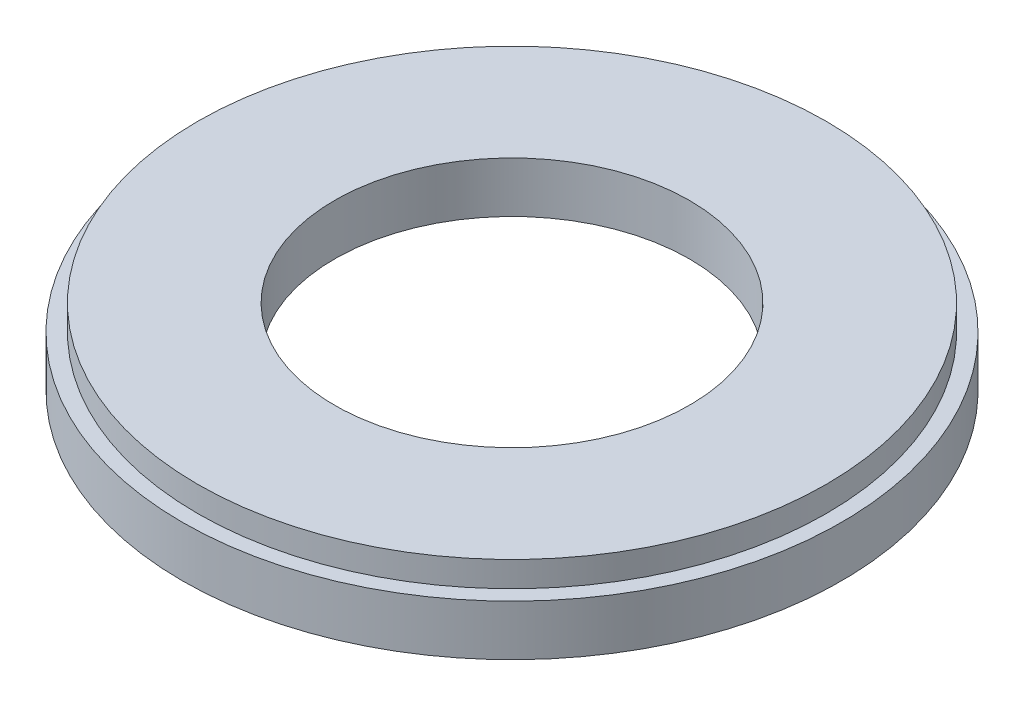
ISO-10303-21;
HEADER;
FILE_DESCRIPTION(('STEP AP214'),'2;1');
FILE_NAME('part.step','',(''),(''),'','','');
FILE_SCHEMA(('AUTOMOTIVE_DESIGN { 1 0 10303 214 1 1 1 1 }'));
ENDSEC;
DATA;
#1=APPLICATION_CONTEXT('core data for automotive mechanical design processes');
#2=APPLICATION_PROTOCOL_DEFINITION('international standard','automotive_design',2000,#1);
#3=PRODUCT_CONTEXT('',#1,'mechanical');
#4=PRODUCT('Part','Part','',(#3));
#5=PRODUCT_RELATED_PRODUCT_CATEGORY('part','',(#4));
#6=PRODUCT_DEFINITION_FORMATION('','',#4);
#7=PRODUCT_DEFINITION_CONTEXT('part definition',#1,'design');
#8=PRODUCT_DEFINITION('design','',#6,#7);
#9=PRODUCT_DEFINITION_SHAPE('','',#8);
#10=(LENGTH_UNIT() NAMED_UNIT(*) SI_UNIT(.MILLI.,.METRE.));
#11=(NAMED_UNIT(*) PLANE_ANGLE_UNIT() SI_UNIT($,.RADIAN.));
#12=(NAMED_UNIT(*) SI_UNIT($,.STERADIAN.) SOLID_ANGLE_UNIT());
#13=UNCERTAINTY_MEASURE_WITH_UNIT(LENGTH_MEASURE(1.E-05),#10,'distance_accuracy_value','');
#14=(GEOMETRIC_REPRESENTATION_CONTEXT(3) GLOBAL_UNCERTAINTY_ASSIGNED_CONTEXT((#13)) GLOBAL_UNIT_ASSIGNED_CONTEXT((#10,
#11,#12)) REPRESENTATION_CONTEXT('',''));
#15=CARTESIAN_POINT('',(0.,0.,0.));
#16=DIRECTION('',(0.,0.,1.));
#17=DIRECTION('',(1.,0.,0.));
#18=AXIS2_PLACEMENT_3D('',#15,#16,#17);
#19=CARTESIAN_POINT('',(0.,0.,0.));
#20=DIRECTION('',(0.,-1.,0.));
#21=DIRECTION('',(0.,0.,-1.));
#22=AXIS2_PLACEMENT_3D('',#19,#20,#21);
#23=PLANE('',#22);
#24=CARTESIAN_POINT('',(0.,0.,0.));
#25=DIRECTION('',(0.,-1.,0.));
#26=DIRECTION('',(0.,0.,-1.));
#27=AXIS2_PLACEMENT_3D('',#24,#25,#26);
#28=CIRCLE('',#27,35.);
#29=CARTESIAN_POINT('',(0.,0.,-35.));
#30=VERTEX_POINT('',#29);
#31=EDGE_CURVE('E74',#30,#30,#28,.T.);
#32=ORIENTED_EDGE('',*,*,#31,.F.);
#33=EDGE_LOOP('',(#32));
#34=FACE_BOUND('',#33,.T.);
#35=CARTESIAN_POINT('',(0.,0.,0.));
#36=DIRECTION('',(0.,-1.,0.));
#37=DIRECTION('',(0.,0.,-1.));
#38=AXIS2_PLACEMENT_3D('',#35,#36,#37);
#39=CIRCLE('',#38,63.);
#40=CARTESIAN_POINT('',(0.,0.,-63.));
#41=VERTEX_POINT('',#40);
#42=EDGE_CURVE('E10',#41,#41,#39,.F.);
#43=ORIENTED_EDGE('',*,*,#42,.F.);
#44=EDGE_LOOP('',(#43));
#45=FACE_BOUND('',#44,.T.);
#46=ADVANCED_FACE('F41',(#34,#45),#23,.T.);
#47=CARTESIAN_POINT('',(0.,9.99999999999998,0.));
#48=DIRECTION('',(0.,1.,0.));
#49=DIRECTION('',(0.,0.,1.));
#50=AXIS2_PLACEMENT_3D('',#47,#48,#49);
#51=PLANE('',#50);
#52=CARTESIAN_POINT('',(0.,9.99999999999998,0.));
#53=DIRECTION('',(0.,-1.,0.));
#54=DIRECTION('',(0.,0.,-1.));
#55=AXIS2_PLACEMENT_3D('',#52,#53,#54);
#56=CIRCLE('',#55,35.);
#57=CARTESIAN_POINT('',(0.,9.99999999999998,-35.));
#58=VERTEX_POINT('',#57);
#59=EDGE_CURVE('E68',#58,#58,#56,.T.);
#60=ORIENTED_EDGE('',*,*,#59,.T.);
#61=EDGE_LOOP('',(#60));
#62=FACE_BOUND('',#61,.T.);
#63=CARTESIAN_POINT('',(0.,9.99999999999998,0.));
#64=DIRECTION('',(0.,-1.,0.));
#65=DIRECTION('',(0.,0.,-1.));
#66=AXIS2_PLACEMENT_3D('',#63,#64,#65);
#67=CIRCLE('',#66,62.);
#68=CARTESIAN_POINT('',(0.,9.99999999999998,-62.));
#69=VERTEX_POINT('',#68);
#70=EDGE_CURVE('E50',#69,#69,#67,.T.);
#71=ORIENTED_EDGE('',*,*,#70,.F.);
#72=EDGE_LOOP('',(#71));
#73=FACE_BOUND('',#72,.T.);
#74=ADVANCED_FACE('F97',(#62,#73),#51,.T.);
#75=CARTESIAN_POINT('',(0.,0.,0.));
#76=DIRECTION('',(0.,-1.,0.));
#77=DIRECTION('',(0.,0.,-1.));
#78=AXIS2_PLACEMENT_3D('',#75,#76,#77);
#79=CYLINDRICAL_SURFACE('',#78,62.);
#80=CARTESIAN_POINT('',(0.,5.,0.));
#81=DIRECTION('',(0.,-1.,0.));
#82=DIRECTION('',(0.,0.,-1.));
#83=AXIS2_PLACEMENT_3D('',#80,#81,#82);
#84=CIRCLE('',#83,62.);
#85=CARTESIAN_POINT('',(0.,5.,-62.));
#86=VERTEX_POINT('',#85);
#87=EDGE_CURVE('E57',#86,#86,#84,.T.);
#88=ORIENTED_EDGE('',*,*,#87,.F.);
#89=EDGE_LOOP('',(#88));
#90=FACE_BOUND('',#89,.T.);
#91=ORIENTED_EDGE('',*,*,#70,.T.);
#92=EDGE_LOOP('',(#91));
#93=FACE_BOUND('',#92,.T.);
#94=ADVANCED_FACE('F94',(#90,#93),#79,.T.);
#95=CARTESIAN_POINT('',(0.,5.,0.));
#96=DIRECTION('',(0.,1.,0.));
#97=DIRECTION('',(0.,0.,1.));
#98=AXIS2_PLACEMENT_3D('',#95,#96,#97);
#99=PLANE('',#98);
#100=ORIENTED_EDGE('',*,*,#87,.T.);
#101=EDGE_LOOP('',(#100));
#102=FACE_BOUND('',#101,.T.);
#103=CARTESIAN_POINT('',(0.,5.,0.));
#104=DIRECTION('',(0.,-1.,0.));
#105=DIRECTION('',(0.,0.,-1.));
#106=AXIS2_PLACEMENT_3D('',#103,#104,#105);
#107=CIRCLE('',#106,65.);
#108=CARTESIAN_POINT('',(0.,5.,-65.));
#109=VERTEX_POINT('',#108);
#110=EDGE_CURVE('E81',#109,#109,#107,.T.);
#111=ORIENTED_EDGE('',*,*,#110,.F.);
#112=EDGE_LOOP('',(#111));
#113=FACE_BOUND('',#112,.T.);
#114=ADVANCED_FACE('F91',(#102,#113),#99,.T.);
#115=CARTESIAN_POINT('',(0.,0.,0.));
#116=DIRECTION('',(0.,-1.,0.));
#117=DIRECTION('',(0.,0.,-1.));
#118=AXIS2_PLACEMENT_3D('',#115,#116,#117);
#119=CYLINDRICAL_SURFACE('',#118,65.);
#120=ORIENTED_EDGE('',*,*,#110,.T.);
#121=EDGE_LOOP('',(#120));
#122=FACE_BOUND('',#121,.T.);
#123=CARTESIAN_POINT('',(0.,-5.,0.));
#124=DIRECTION('',(0.,-1.,0.));
#125=DIRECTION('',(0.,0.,-1.));
#126=AXIS2_PLACEMENT_3D('',#123,#124,#125);
#127=CIRCLE('',#126,65.);
#128=CARTESIAN_POINT('',(0.,-5.,-65.));
#129=VERTEX_POINT('',#128);
#130=EDGE_CURVE('E45',#129,#129,#127,.T.);
#131=ORIENTED_EDGE('',*,*,#130,.F.);
#132=EDGE_LOOP('',(#131));
#133=FACE_BOUND('',#132,.T.);
#134=ADVANCED_FACE('F116',(#122,#133),#119,.T.);
#135=CARTESIAN_POINT('',(0.,0.,0.));
#136=DIRECTION('',(0.,-1.,0.));
#137=DIRECTION('',(0.,0.,-1.));
#138=AXIS2_PLACEMENT_3D('',#135,#136,#137);
#139=CYLINDRICAL_SURFACE('',#138,35.);
#140=ORIENTED_EDGE('',*,*,#31,.T.);
#141=EDGE_LOOP('',(#140));
#142=FACE_BOUND('',#141,.T.);
#143=ORIENTED_EDGE('',*,*,#59,.F.);
#144=EDGE_LOOP('',(#143));
#145=FACE_BOUND('',#144,.T.);
#146=ADVANCED_FACE('F110',(#142,#145),#139,.F.);
#147=CARTESIAN_POINT('',(-65.,-5.,0.));
#148=DIRECTION('',(0.,1.,0.));
#149=DIRECTION('',(0.,0.,1.));
#150=AXIS2_PLACEMENT_3D('',#147,#148,#149);
#151=PLANE('',#150);
#152=CARTESIAN_POINT('',(0.,-5.,0.));
#153=DIRECTION('',(0.,-1.,0.));
#154=DIRECTION('',(0.,0.,-1.));
#155=AXIS2_PLACEMENT_3D('',#152,#153,#154);
#156=CIRCLE('',#155,63.);
#157=CARTESIAN_POINT('',(0.,-5.,-63.));
#158=VERTEX_POINT('',#157);
#159=EDGE_CURVE('E60',#158,#158,#156,.T.);
#160=ORIENTED_EDGE('',*,*,#159,.F.);
#161=EDGE_LOOP('',(#160));
#162=FACE_BOUND('',#161,.T.);
#163=ORIENTED_EDGE('',*,*,#130,.T.);
#164=EDGE_LOOP('',(#163));
#165=FACE_BOUND('',#164,.T.);
#166=ADVANCED_FACE('F43',(#162,#165),#151,.F.);
#167=CARTESIAN_POINT('',(0.,0.,0.));
#168=DIRECTION('',(0.,-1.,0.));
#169=DIRECTION('',(0.,0.,-1.));
#170=AXIS2_PLACEMENT_3D('',#167,#168,#169);
#171=CYLINDRICAL_SURFACE('',#170,63.);
#172=ORIENTED_EDGE('',*,*,#159,.T.);
#173=EDGE_LOOP('',(#172));
#174=FACE_BOUND('',#173,.T.);
#175=ORIENTED_EDGE('',*,*,#42,.T.);
#176=EDGE_LOOP('',(#175));
#177=FACE_BOUND('',#176,.T.);
#178=ADVANCED_FACE('F108',(#174,#177),#171,.F.);
#179=CLOSED_SHELL('',(#46,#74,#94,#114,#134,#146,#166,#178));
#180=MANIFOLD_SOLID_BREP('B2',#179);
#181=ADVANCED_BREP_SHAPE_REPRESENTATION('',(#18,#180),#14);
#182=SHAPE_DEFINITION_REPRESENTATION(#9,#181);
ENDSEC;
END-ISO-10303-21;
